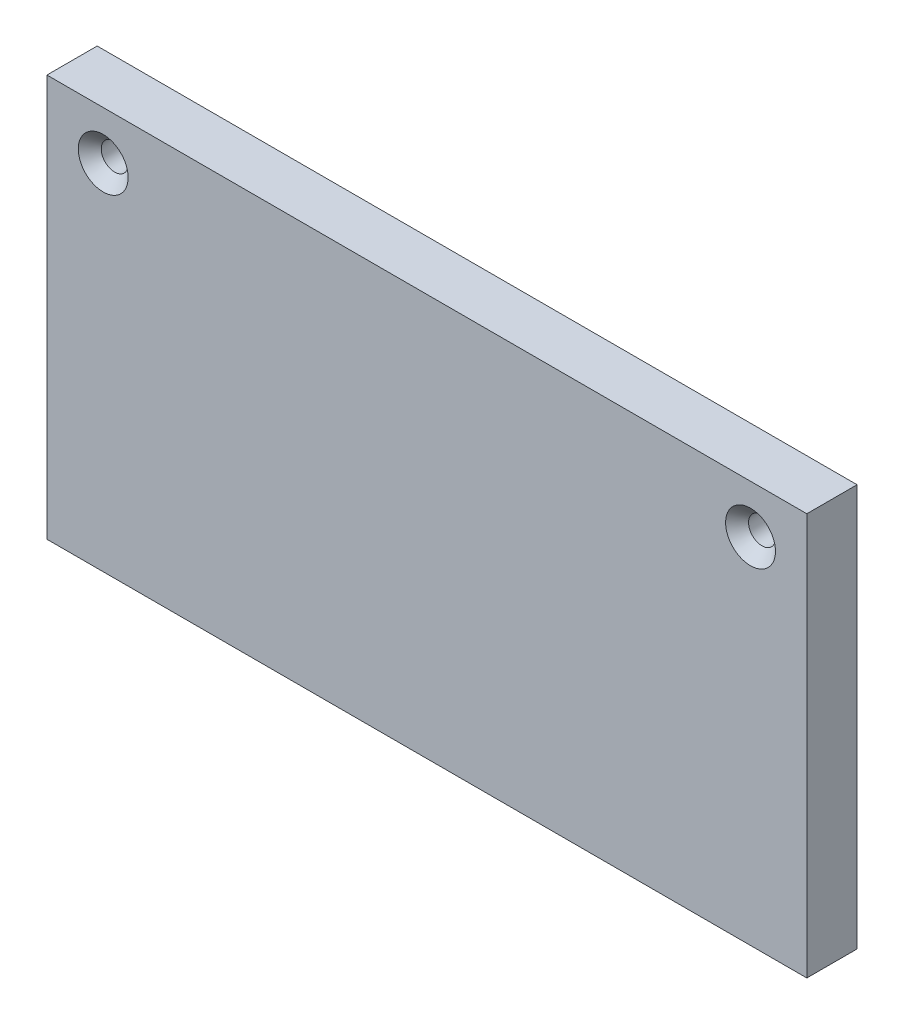
ISO-10303-21;
HEADER;
FILE_DESCRIPTION(('STEP AP214'),'2;1');
FILE_NAME('part.step','',(''),(''),'','','');
FILE_SCHEMA(('AUTOMOTIVE_DESIGN { 1 0 10303 214 1 1 1 1 }'));
ENDSEC;
DATA;
#1=APPLICATION_CONTEXT('core data for automotive mechanical design processes');
#2=APPLICATION_PROTOCOL_DEFINITION('international standard','automotive_design',2000,#1);
#3=PRODUCT_CONTEXT('',#1,'mechanical');
#4=PRODUCT('Part','Part','',(#3));
#5=PRODUCT_RELATED_PRODUCT_CATEGORY('part','',(#4));
#6=PRODUCT_DEFINITION_FORMATION('','',#4);
#7=PRODUCT_DEFINITION_CONTEXT('part definition',#1,'design');
#8=PRODUCT_DEFINITION('design','',#6,#7);
#9=PRODUCT_DEFINITION_SHAPE('','',#8);
#10=(LENGTH_UNIT() NAMED_UNIT(*) SI_UNIT(.MILLI.,.METRE.));
#11=(NAMED_UNIT(*) PLANE_ANGLE_UNIT() SI_UNIT($,.RADIAN.));
#12=(NAMED_UNIT(*) SI_UNIT($,.STERADIAN.) SOLID_ANGLE_UNIT());
#13=UNCERTAINTY_MEASURE_WITH_UNIT(LENGTH_MEASURE(1.E-05),#10,'distance_accuracy_value','');
#14=(GEOMETRIC_REPRESENTATION_CONTEXT(3) GLOBAL_UNCERTAINTY_ASSIGNED_CONTEXT((#13)) GLOBAL_UNIT_ASSIGNED_CONTEXT((#10,
#11,#12)) REPRESENTATION_CONTEXT('',''));
#15=CARTESIAN_POINT('',(0.,0.,0.));
#16=DIRECTION('',(0.,0.,1.));
#17=DIRECTION('',(1.,0.,0.));
#18=AXIS2_PLACEMENT_3D('',#15,#16,#17);
#19=CARTESIAN_POINT('',(0.,50.8,6.35));
#20=DIRECTION('',(1.,0.,0.));
#21=DIRECTION('',(0.,1.,0.));
#22=AXIS2_PLACEMENT_3D('',#19,#20,#21);
#23=PLANE('',#22);
#24=DIRECTION('',(0.,-1.,0.));
#25=VECTOR('',#24,1.);
#26=CARTESIAN_POINT('',(0.,50.8,0.));
#27=LINE('',#26,#25);
#28=CARTESIAN_POINT('',(0.,50.8,0.));
#29=VERTEX_POINT('',#28);
#30=CARTESIAN_POINT('',(0.,0.,0.));
#31=VERTEX_POINT('',#30);
#32=EDGE_CURVE('E102',#29,#31,#27,.T.);
#33=ORIENTED_EDGE('',*,*,#32,.T.);
#34=DIRECTION('',(0.,0.,-1.));
#35=VECTOR('',#34,1.);
#36=CARTESIAN_POINT('',(0.,0.,6.35));
#37=LINE('',#36,#35);
#38=CARTESIAN_POINT('',(0.,0.,6.35));
#39=VERTEX_POINT('',#38);
#40=EDGE_CURVE('E11',#39,#31,#37,.T.);
#41=ORIENTED_EDGE('',*,*,#40,.F.);
#42=DIRECTION('',(0.,-1.,0.));
#43=VECTOR('',#42,1.);
#44=CARTESIAN_POINT('',(0.,50.8,6.35));
#45=LINE('',#44,#43);
#46=CARTESIAN_POINT('',(0.,50.8,6.35));
#47=VERTEX_POINT('',#46);
#48=EDGE_CURVE('E95',#47,#39,#45,.T.);
#49=ORIENTED_EDGE('',*,*,#48,.F.);
#50=DIRECTION('',(0.,0.,-1.));
#51=VECTOR('',#50,1.);
#52=CARTESIAN_POINT('',(0.,50.8,6.35));
#53=LINE('',#52,#51);
#54=EDGE_CURVE('E99',#47,#29,#53,.T.);
#55=ORIENTED_EDGE('',*,*,#54,.T.);
#56=EDGE_LOOP('',(#33,#41,#49,#55));
#57=FACE_BOUND('',#56,.T.);
#58=ADVANCED_FACE('F41',(#57),#23,.F.);
#59=CARTESIAN_POINT('',(0.,0.,6.35));
#60=DIRECTION('',(0.,1.,0.));
#61=DIRECTION('',(0.,0.,1.));
#62=AXIS2_PLACEMENT_3D('',#59,#60,#61);
#63=PLANE('',#62);
#64=DIRECTION('',(1.,0.,0.));
#65=VECTOR('',#64,1.);
#66=CARTESIAN_POINT('',(0.,0.,0.));
#67=LINE('',#66,#65);
#68=CARTESIAN_POINT('',(96.012,0.,0.));
#69=VERTEX_POINT('',#68);
#70=EDGE_CURVE('E96',#31,#69,#67,.T.);
#71=ORIENTED_EDGE('',*,*,#70,.T.);
#72=DIRECTION('',(0.,0.,-1.));
#73=VECTOR('',#72,1.);
#74=CARTESIAN_POINT('',(96.012,0.,6.35));
#75=LINE('',#74,#73);
#76=CARTESIAN_POINT('',(96.012,0.,6.35));
#77=VERTEX_POINT('',#76);
#78=EDGE_CURVE('E47',#77,#69,#75,.T.);
#79=ORIENTED_EDGE('',*,*,#78,.F.);
#80=DIRECTION('',(1.,0.,0.));
#81=VECTOR('',#80,1.);
#82=CARTESIAN_POINT('',(0.,0.,6.35));
#83=LINE('',#82,#81);
#84=EDGE_CURVE('E87',#39,#77,#83,.T.);
#85=ORIENTED_EDGE('',*,*,#84,.F.);
#86=ORIENTED_EDGE('',*,*,#40,.T.);
#87=EDGE_LOOP('',(#71,#79,#85,#86));
#88=FACE_BOUND('',#87,.T.);
#89=ADVANCED_FACE('F92',(#88),#63,.F.);
#90=CARTESIAN_POINT('',(96.012,0.,6.35));
#91=DIRECTION('',(-1.,0.,0.));
#92=DIRECTION('',(0.,0.,1.));
#93=AXIS2_PLACEMENT_3D('',#90,#91,#92);
#94=PLANE('',#93);
#95=DIRECTION('',(0.,1.,0.));
#96=VECTOR('',#95,1.);
#97=CARTESIAN_POINT('',(96.012,0.,0.));
#98=LINE('',#97,#96);
#99=CARTESIAN_POINT('',(96.012,50.8,0.));
#100=VERTEX_POINT('',#99);
#101=EDGE_CURVE('E74',#69,#100,#98,.T.);
#102=ORIENTED_EDGE('',*,*,#101,.T.);
#103=DIRECTION('',(0.,0.,-1.));
#104=VECTOR('',#103,1.);
#105=CARTESIAN_POINT('',(96.012,50.8,6.35));
#106=LINE('',#105,#104);
#107=CARTESIAN_POINT('',(96.012,50.8,6.35));
#108=VERTEX_POINT('',#107);
#109=EDGE_CURVE('E100',#108,#100,#106,.T.);
#110=ORIENTED_EDGE('',*,*,#109,.F.);
#111=DIRECTION('',(0.,1.,0.));
#112=VECTOR('',#111,1.);
#113=CARTESIAN_POINT('',(96.012,0.,6.35));
#114=LINE('',#113,#112);
#115=EDGE_CURVE('E89',#77,#108,#114,.T.);
#116=ORIENTED_EDGE('',*,*,#115,.F.);
#117=ORIENTED_EDGE('',*,*,#78,.T.);
#118=EDGE_LOOP('',(#102,#110,#116,#117));
#119=FACE_BOUND('',#118,.T.);
#120=ADVANCED_FACE('F98',(#119),#94,.F.);
#121=CARTESIAN_POINT('',(96.012,50.8,6.35));
#122=DIRECTION('',(0.,-1.,0.));
#123=DIRECTION('',(1.,0.,0.));
#124=AXIS2_PLACEMENT_3D('',#121,#122,#123);
#125=PLANE('',#124);
#126=DIRECTION('',(-1.,0.,0.));
#127=VECTOR('',#126,1.);
#128=CARTESIAN_POINT('',(96.012,50.8,0.));
#129=LINE('',#128,#127);
#130=EDGE_CURVE('E77',#100,#29,#129,.T.);
#131=ORIENTED_EDGE('',*,*,#130,.T.);
#132=ORIENTED_EDGE('',*,*,#54,.F.);
#133=DIRECTION('',(-1.,0.,0.));
#134=VECTOR('',#133,1.);
#135=CARTESIAN_POINT('',(96.012,50.8,6.35));
#136=LINE('',#135,#134);
#137=EDGE_CURVE('E60',#108,#47,#136,.T.);
#138=ORIENTED_EDGE('',*,*,#137,.F.);
#139=ORIENTED_EDGE('',*,*,#109,.T.);
#140=EDGE_LOOP('',(#131,#132,#138,#139));
#141=FACE_BOUND('',#140,.T.);
#142=ADVANCED_FACE('F115',(#141),#125,.F.);
#143=CARTESIAN_POINT('',(0.,0.,6.35));
#144=DIRECTION('',(0.,0.,1.));
#145=DIRECTION('',(1.,0.,0.));
#146=AXIS2_PLACEMENT_3D('',#143,#144,#145);
#147=PLANE('',#146);
#148=CARTESIAN_POINT('',(7.112,44.704,6.35));
#149=DIRECTION('',(0.,0.,1.));
#150=DIRECTION('',(1.,0.,0.));
#151=AXIS2_PLACEMENT_3D('',#148,#149,#150);
#152=CIRCLE('',#151,3.15);
#153=CARTESIAN_POINT('',(10.262,44.704,6.35));
#154=VERTEX_POINT('',#153);
#155=EDGE_CURVE('E131',#154,#154,#152,.T.);
#156=ORIENTED_EDGE('',*,*,#155,.F.);
#157=EDGE_LOOP('',(#156));
#158=FACE_BOUND('',#157,.T.);
#159=CARTESIAN_POINT('',(88.9,44.704,6.35));
#160=DIRECTION('',(0.,0.,1.));
#161=DIRECTION('',(1.,0.,0.));
#162=AXIS2_PLACEMENT_3D('',#159,#160,#161);
#163=CIRCLE('',#162,3.15);
#164=CARTESIAN_POINT('',(92.05,44.704,6.35));
#165=VERTEX_POINT('',#164);
#166=EDGE_CURVE('E124',#165,#165,#163,.T.);
#167=ORIENTED_EDGE('',*,*,#166,.F.);
#168=EDGE_LOOP('',(#167));
#169=FACE_BOUND('',#168,.T.);
#170=ORIENTED_EDGE('',*,*,#48,.T.);
#171=ORIENTED_EDGE('',*,*,#84,.T.);
#172=ORIENTED_EDGE('',*,*,#115,.T.);
#173=ORIENTED_EDGE('',*,*,#137,.T.);
#174=EDGE_LOOP('',(#170,#171,#172,#173));
#175=FACE_BOUND('',#174,.T.);
#176=ADVANCED_FACE('F86',(#158,#169,#175),#147,.T.);
#177=CARTESIAN_POINT('',(0.,0.,0.));
#178=DIRECTION('',(0.,0.,1.));
#179=DIRECTION('',(1.,0.,0.));
#180=AXIS2_PLACEMENT_3D('',#177,#178,#179);
#181=PLANE('',#180);
#182=CARTESIAN_POINT('',(7.112,44.704,0.));
#183=DIRECTION('',(0.,0.,1.));
#184=DIRECTION('',(1.,0.,0.));
#185=AXIS2_PLACEMENT_3D('',#182,#183,#184);
#186=CIRCLE('',#185,1.69999999999999);
#187=CARTESIAN_POINT('',(8.81199999999999,44.704,0.));
#188=VERTEX_POINT('',#187);
#189=EDGE_CURVE('E127',#188,#188,#186,.T.);
#190=ORIENTED_EDGE('',*,*,#189,.T.);
#191=EDGE_LOOP('',(#190));
#192=FACE_BOUND('',#191,.T.);
#193=CARTESIAN_POINT('',(88.9,44.704,0.));
#194=DIRECTION('',(0.,0.,1.));
#195=DIRECTION('',(1.,0.,0.));
#196=AXIS2_PLACEMENT_3D('',#193,#194,#195);
#197=CIRCLE('',#196,1.69999999999999);
#198=CARTESIAN_POINT('',(90.6,44.704,0.));
#199=VERTEX_POINT('',#198);
#200=EDGE_CURVE('E110',#199,#199,#197,.T.);
#201=ORIENTED_EDGE('',*,*,#200,.T.);
#202=EDGE_LOOP('',(#201));
#203=FACE_BOUND('',#202,.T.);
#204=ORIENTED_EDGE('',*,*,#32,.F.);
#205=ORIENTED_EDGE('',*,*,#130,.F.);
#206=ORIENTED_EDGE('',*,*,#101,.F.);
#207=ORIENTED_EDGE('',*,*,#70,.F.);
#208=EDGE_LOOP('',(#204,#205,#206,#207));
#209=FACE_BOUND('',#208,.T.);
#210=ADVANCED_FACE('F113',(#192,#203,#209),#181,.F.);
#211=CARTESIAN_POINT('',(88.9,44.704,6.35));
#212=DIRECTION('',(0.,0.,1.));
#213=DIRECTION('',(1.,0.,0.));
#214=AXIS2_PLACEMENT_3D('',#211,#212,#213);
#215=CYLINDRICAL_SURFACE('',#214,1.69999999999999);
#216=ORIENTED_EDGE('',*,*,#200,.F.);
#217=EDGE_LOOP('',(#216));
#218=FACE_BOUND('',#217,.T.);
#219=CARTESIAN_POINT('',(88.9,44.704,4.89999999999999));
#220=DIRECTION('',(0.,0.,1.));
#221=DIRECTION('',(1.,0.,0.));
#222=AXIS2_PLACEMENT_3D('',#219,#220,#221);
#223=CIRCLE('',#222,1.69999999999999);
#224=CARTESIAN_POINT('',(90.6,44.704,4.89999999999999));
#225=VERTEX_POINT('',#224);
#226=EDGE_CURVE('E117',#225,#225,#223,.T.);
#227=ORIENTED_EDGE('',*,*,#226,.T.);
#228=EDGE_LOOP('',(#227));
#229=FACE_BOUND('',#228,.T.);
#230=ADVANCED_FACE('F148',(#218,#229),#215,.F.);
#231=CARTESIAN_POINT('',(88.9,44.704,6.35));
#232=DIRECTION('',(0.,0.,1.));
#233=DIRECTION('',(1.,0.,0.));
#234=AXIS2_PLACEMENT_3D('',#231,#232,#233);
#235=CONICAL_SURFACE('',#234,3.15,0.785398163397448);
#236=ORIENTED_EDGE('',*,*,#226,.F.);
#237=EDGE_LOOP('',(#236));
#238=FACE_BOUND('',#237,.T.);
#239=ORIENTED_EDGE('',*,*,#166,.T.);
#240=EDGE_LOOP('',(#239));
#241=FACE_BOUND('',#240,.T.);
#242=ADVANCED_FACE('F141',(#238,#241),#235,.F.);
#243=CARTESIAN_POINT('',(7.112,44.704,6.35));
#244=DIRECTION('',(0.,0.,1.));
#245=DIRECTION('',(1.,0.,0.));
#246=AXIS2_PLACEMENT_3D('',#243,#244,#245);
#247=CYLINDRICAL_SURFACE('',#246,1.69999999999999);
#248=ORIENTED_EDGE('',*,*,#189,.F.);
#249=EDGE_LOOP('',(#248));
#250=FACE_BOUND('',#249,.T.);
#251=CARTESIAN_POINT('',(7.112,44.704,4.89999999999999));
#252=DIRECTION('',(0.,0.,1.));
#253=DIRECTION('',(1.,0.,0.));
#254=AXIS2_PLACEMENT_3D('',#251,#252,#253);
#255=CIRCLE('',#254,1.69999999999999);
#256=CARTESIAN_POINT('',(8.81199999999999,44.704,4.89999999999999));
#257=VERTEX_POINT('',#256);
#258=EDGE_CURVE('E129',#257,#257,#255,.T.);
#259=ORIENTED_EDGE('',*,*,#258,.T.);
#260=EDGE_LOOP('',(#259));
#261=FACE_BOUND('',#260,.T.);
#262=ADVANCED_FACE('F144',(#250,#261),#247,.F.);
#263=CARTESIAN_POINT('',(7.112,44.704,6.35));
#264=DIRECTION('',(0.,0.,1.));
#265=DIRECTION('',(1.,0.,0.));
#266=AXIS2_PLACEMENT_3D('',#263,#264,#265);
#267=CONICAL_SURFACE('',#266,3.15,0.785398163397449);
#268=ORIENTED_EDGE('',*,*,#258,.F.);
#269=EDGE_LOOP('',(#268));
#270=FACE_BOUND('',#269,.T.);
#271=ORIENTED_EDGE('',*,*,#155,.T.);
#272=EDGE_LOOP('',(#271));
#273=FACE_BOUND('',#272,.T.);
#274=ADVANCED_FACE('F136',(#270,#273),#267,.F.);
#275=CLOSED_SHELL('',(#58,#89,#120,#142,#176,#210,#230,#242,#262,#274));
#276=MANIFOLD_SOLID_BREP('B2',#275);
#277=ADVANCED_BREP_SHAPE_REPRESENTATION('',(#18,#276),#14);
#278=SHAPE_DEFINITION_REPRESENTATION(#9,#277);
ENDSEC;
END-ISO-10303-21;
